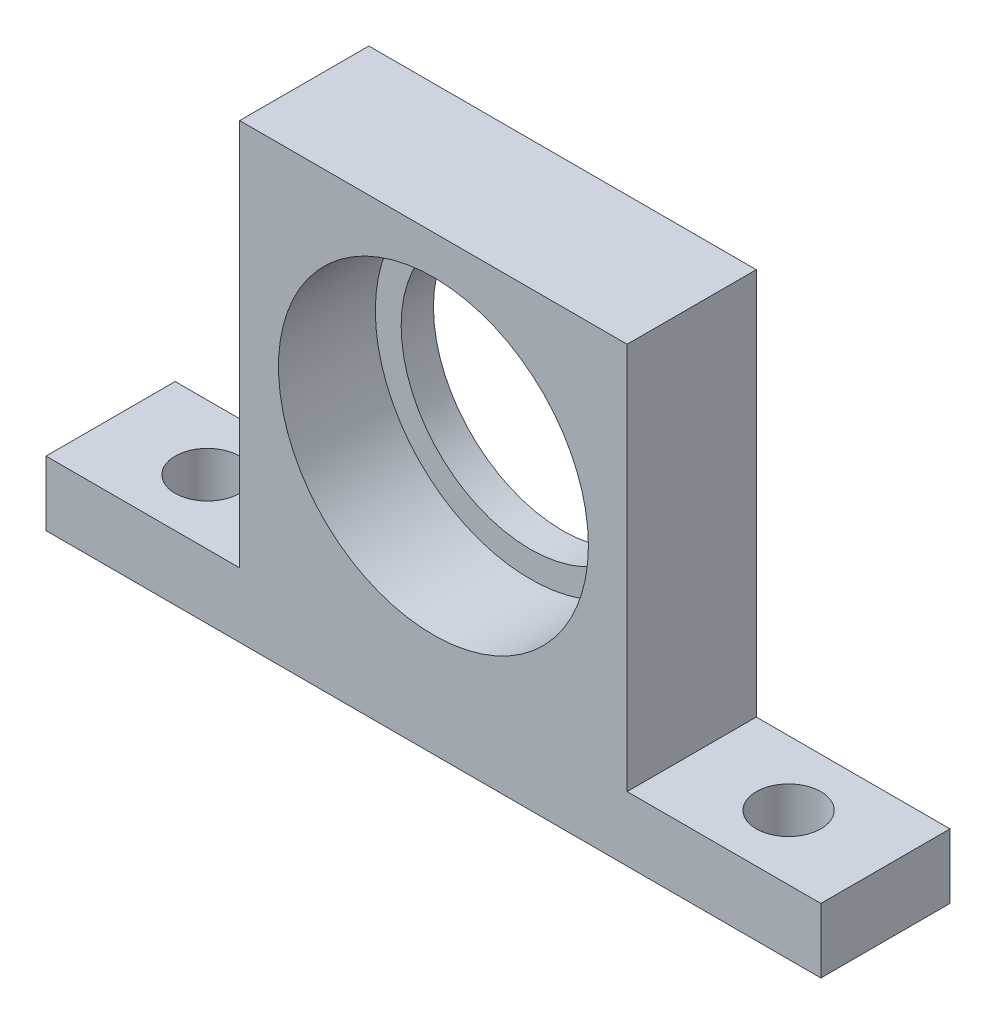
ISO-10303-21;
HEADER;
FILE_DESCRIPTION(('STEP AP214'),'2;1');
FILE_NAME('part.step','',(''),(''),'','','');
FILE_SCHEMA(('AUTOMOTIVE_DESIGN { 1 0 10303 214 1 1 1 1 }'));
ENDSEC;
DATA;
#1=APPLICATION_CONTEXT('core data for automotive mechanical design processes');
#2=APPLICATION_PROTOCOL_DEFINITION('international standard','automotive_design',2000,#1);
#3=PRODUCT_CONTEXT('',#1,'mechanical');
#4=PRODUCT('Part','Part','',(#3));
#5=PRODUCT_RELATED_PRODUCT_CATEGORY('part','',(#4));
#6=PRODUCT_DEFINITION_FORMATION('','',#4);
#7=PRODUCT_DEFINITION_CONTEXT('part definition',#1,'design');
#8=PRODUCT_DEFINITION('design','',#6,#7);
#9=PRODUCT_DEFINITION_SHAPE('','',#8);
#10=(LENGTH_UNIT() NAMED_UNIT(*) SI_UNIT(.MILLI.,.METRE.));
#11=(NAMED_UNIT(*) PLANE_ANGLE_UNIT() SI_UNIT($,.RADIAN.));
#12=(NAMED_UNIT(*) SI_UNIT($,.STERADIAN.) SOLID_ANGLE_UNIT());
#13=UNCERTAINTY_MEASURE_WITH_UNIT(LENGTH_MEASURE(1.E-05),#10,'distance_accuracy_value','');
#14=(GEOMETRIC_REPRESENTATION_CONTEXT(3) GLOBAL_UNCERTAINTY_ASSIGNED_CONTEXT((#13)) GLOBAL_UNIT_ASSIGNED_CONTEXT((#10,
#11,#12)) REPRESENTATION_CONTEXT('',''));
#15=CARTESIAN_POINT('',(0.,0.,0.));
#16=DIRECTION('',(0.,0.,1.));
#17=DIRECTION('',(1.,0.,0.));
#18=AXIS2_PLACEMENT_3D('',#15,#16,#17);
#19=CARTESIAN_POINT('',(-38.1,6.35,12.7));
#20=DIRECTION('',(0.,0.,-1.));
#21=DIRECTION('',(-1.,0.,0.));
#22=AXIS2_PLACEMENT_3D('',#19,#20,#21);
#23=PLANE('',#22);
#24=CARTESIAN_POINT('',(0.,25.4,12.7));
#25=DIRECTION('',(0.,0.,1.));
#26=DIRECTION('',(1.,0.,0.));
#27=AXIS2_PLACEMENT_3D('',#24,#25,#26);
#28=CIRCLE('',#27,15.24);
#29=CARTESIAN_POINT('',(15.24,25.4,12.7));
#30=VERTEX_POINT('',#29);
#31=EDGE_CURVE('E187',#30,#30,#28,.T.);
#32=ORIENTED_EDGE('',*,*,#31,.F.);
#33=EDGE_LOOP('',(#32));
#34=FACE_BOUND('',#33,.T.);
#35=DIRECTION('',(0.,-1.,0.));
#36=VECTOR('',#35,1.);
#37=CARTESIAN_POINT('',(-38.1,0.,12.7));
#38=LINE('',#37,#36);
#39=CARTESIAN_POINT('',(-38.1,6.35,12.7));
#40=VERTEX_POINT('',#39);
#41=CARTESIAN_POINT('',(-38.1,0.,12.7));
#42=VERTEX_POINT('',#41);
#43=EDGE_CURVE('E147',#40,#42,#38,.T.);
#44=ORIENTED_EDGE('',*,*,#43,.T.);
#45=DIRECTION('',(1.,0.,0.));
#46=VECTOR('',#45,1.);
#47=CARTESIAN_POINT('',(38.1,0.,12.7));
#48=LINE('',#47,#46);
#49=CARTESIAN_POINT('',(38.1,0.,12.7));
#50=VERTEX_POINT('',#49);
#51=EDGE_CURVE('E96',#42,#50,#48,.T.);
#52=ORIENTED_EDGE('',*,*,#51,.T.);
#53=DIRECTION('',(0.,1.,0.));
#54=VECTOR('',#53,1.);
#55=CARTESIAN_POINT('',(38.1,0.,12.7));
#56=LINE('',#55,#54);
#57=CARTESIAN_POINT('',(38.1,6.35,12.7));
#58=VERTEX_POINT('',#57);
#59=EDGE_CURVE('E163',#50,#58,#56,.T.);
#60=ORIENTED_EDGE('',*,*,#59,.T.);
#61=DIRECTION('',(-1.,0.,0.));
#62=VECTOR('',#61,1.);
#63=CARTESIAN_POINT('',(38.1,6.35,12.7));
#64=LINE('',#63,#62);
#65=CARTESIAN_POINT('',(19.05,6.35,12.7));
#66=VERTEX_POINT('',#65);
#67=EDGE_CURVE('E176',#58,#66,#64,.T.);
#68=ORIENTED_EDGE('',*,*,#67,.T.);
#69=DIRECTION('',(0.,1.,0.));
#70=VECTOR('',#69,1.);
#71=CARTESIAN_POINT('',(19.05,6.35,12.7));
#72=LINE('',#71,#70);
#73=CARTESIAN_POINT('',(19.05,44.45,12.7));
#74=VERTEX_POINT('',#73);
#75=EDGE_CURVE('E114',#66,#74,#72,.T.);
#76=ORIENTED_EDGE('',*,*,#75,.T.);
#77=DIRECTION('',(-1.,0.,0.));
#78=VECTOR('',#77,1.);
#79=CARTESIAN_POINT('',(-19.05,44.45,12.7));
#80=LINE('',#79,#78);
#81=CARTESIAN_POINT('',(-19.05,44.45,12.7));
#82=VERTEX_POINT('',#81);
#83=EDGE_CURVE('E109',#74,#82,#80,.T.);
#84=ORIENTED_EDGE('',*,*,#83,.T.);
#85=DIRECTION('',(0.,-1.,0.));
#86=VECTOR('',#85,1.);
#87=CARTESIAN_POINT('',(-19.05,6.35,12.7));
#88=LINE('',#87,#86);
#89=CARTESIAN_POINT('',(-19.05,6.35,12.7));
#90=VERTEX_POINT('',#89);
#91=EDGE_CURVE('E112',#82,#90,#88,.T.);
#92=ORIENTED_EDGE('',*,*,#91,.T.);
#93=DIRECTION('',(-1.,0.,0.));
#94=VECTOR('',#93,1.);
#95=CARTESIAN_POINT('',(-38.1,6.35,12.7));
#96=LINE('',#95,#94);
#97=EDGE_CURVE('E53',#90,#40,#96,.T.);
#98=ORIENTED_EDGE('',*,*,#97,.T.);
#99=EDGE_LOOP('',(#44,#52,#60,#68,#76,#84,#92,#98));
#100=FACE_BOUND('',#99,.T.);
#101=ADVANCED_FACE('F35',(#34,#100),#23,.F.);
#102=CARTESIAN_POINT('',(-38.1,6.35,0.));
#103=DIRECTION('',(0.,0.,-1.));
#104=DIRECTION('',(-1.,0.,0.));
#105=AXIS2_PLACEMENT_3D('',#102,#103,#104);
#106=PLANE('',#105);
#107=DIRECTION('',(0.,-1.,0.));
#108=VECTOR('',#107,1.);
#109=CARTESIAN_POINT('',(-38.1,0.,0.));
#110=LINE('',#109,#108);
#111=CARTESIAN_POINT('',(-38.1,6.35,0.));
#112=VERTEX_POINT('',#111);
#113=CARTESIAN_POINT('',(-38.1,0.,0.));
#114=VERTEX_POINT('',#113);
#115=EDGE_CURVE('E132',#112,#114,#110,.T.);
#116=ORIENTED_EDGE('',*,*,#115,.F.);
#117=DIRECTION('',(-1.,0.,0.));
#118=VECTOR('',#117,1.);
#119=CARTESIAN_POINT('',(-38.1,6.35,0.));
#120=LINE('',#119,#118);
#121=CARTESIAN_POINT('',(-19.05,6.35,0.));
#122=VERTEX_POINT('',#121);
#123=EDGE_CURVE('E88',#122,#112,#120,.T.);
#124=ORIENTED_EDGE('',*,*,#123,.F.);
#125=DIRECTION('',(0.,-1.,0.));
#126=VECTOR('',#125,1.);
#127=CARTESIAN_POINT('',(-19.05,6.35,0.));
#128=LINE('',#127,#126);
#129=CARTESIAN_POINT('',(-19.05,44.45,0.));
#130=VERTEX_POINT('',#129);
#131=EDGE_CURVE('E82',#130,#122,#128,.T.);
#132=ORIENTED_EDGE('',*,*,#131,.F.);
#133=DIRECTION('',(-1.,0.,0.));
#134=VECTOR('',#133,1.);
#135=CARTESIAN_POINT('',(-19.05,44.45,0.));
#136=LINE('',#135,#134);
#137=CARTESIAN_POINT('',(19.05,44.45,0.));
#138=VERTEX_POINT('',#137);
#139=EDGE_CURVE('E122',#138,#130,#136,.T.);
#140=ORIENTED_EDGE('',*,*,#139,.F.);
#141=DIRECTION('',(0.,1.,0.));
#142=VECTOR('',#141,1.);
#143=CARTESIAN_POINT('',(19.05,6.35,0.));
#144=LINE('',#143,#142);
#145=CARTESIAN_POINT('',(19.05,6.35,0.));
#146=VERTEX_POINT('',#145);
#147=EDGE_CURVE('E142',#146,#138,#144,.T.);
#148=ORIENTED_EDGE('',*,*,#147,.F.);
#149=DIRECTION('',(-1.,0.,0.));
#150=VECTOR('',#149,1.);
#151=CARTESIAN_POINT('',(38.1,6.35,0.));
#152=LINE('',#151,#150);
#153=CARTESIAN_POINT('',(38.1,6.35,0.));
#154=VERTEX_POINT('',#153);
#155=EDGE_CURVE('E140',#154,#146,#152,.T.);
#156=ORIENTED_EDGE('',*,*,#155,.F.);
#157=DIRECTION('',(0.,1.,0.));
#158=VECTOR('',#157,1.);
#159=CARTESIAN_POINT('',(38.1,0.,0.));
#160=LINE('',#159,#158);
#161=CARTESIAN_POINT('',(38.1,0.,0.));
#162=VERTEX_POINT('',#161);
#163=EDGE_CURVE('E138',#162,#154,#160,.T.);
#164=ORIENTED_EDGE('',*,*,#163,.F.);
#165=DIRECTION('',(1.,0.,0.));
#166=VECTOR('',#165,1.);
#167=CARTESIAN_POINT('',(38.1,0.,0.));
#168=LINE('',#167,#166);
#169=EDGE_CURVE('E135',#114,#162,#168,.T.);
#170=ORIENTED_EDGE('',*,*,#169,.F.);
#171=EDGE_LOOP('',(#116,#124,#132,#140,#148,#156,#164,#170));
#172=FACE_BOUND('',#171,.T.);
#173=CARTESIAN_POINT('',(0.,25.4,0.));
#174=DIRECTION('',(0.,0.,1.));
#175=DIRECTION('',(1.,0.,0.));
#176=AXIS2_PLACEMENT_3D('',#173,#174,#175);
#177=CIRCLE('',#176,12.7);
#178=CARTESIAN_POINT('',(12.7,25.4,0.));
#179=VERTEX_POINT('',#178);
#180=EDGE_CURVE('E136',#179,#179,#177,.T.);
#181=ORIENTED_EDGE('',*,*,#180,.T.);
#182=EDGE_LOOP('',(#181));
#183=FACE_BOUND('',#182,.T.);
#184=ADVANCED_FACE('F167',(#172,#183),#106,.T.);
#185=CARTESIAN_POINT('',(-38.1,0.,12.7));
#186=DIRECTION('',(1.,0.,0.));
#187=DIRECTION('',(0.,0.,-1.));
#188=AXIS2_PLACEMENT_3D('',#185,#186,#187);
#189=PLANE('',#188);
#190=ORIENTED_EDGE('',*,*,#115,.T.);
#191=DIRECTION('',(0.,0.,-1.));
#192=VECTOR('',#191,1.);
#193=CARTESIAN_POINT('',(-38.1,0.,12.7));
#194=LINE('',#193,#192);
#195=EDGE_CURVE('E12',#42,#114,#194,.T.);
#196=ORIENTED_EDGE('',*,*,#195,.F.);
#197=ORIENTED_EDGE('',*,*,#43,.F.);
#198=DIRECTION('',(0.,0.,-1.));
#199=VECTOR('',#198,1.);
#200=CARTESIAN_POINT('',(-38.1,6.35,12.7));
#201=LINE('',#200,#199);
#202=EDGE_CURVE('E128',#40,#112,#201,.T.);
#203=ORIENTED_EDGE('',*,*,#202,.T.);
#204=EDGE_LOOP('',(#190,#196,#197,#203));
#205=FACE_BOUND('',#204,.T.);
#206=ADVANCED_FACE('F37',(#205),#189,.F.);
#207=CARTESIAN_POINT('',(38.1,0.,12.7));
#208=DIRECTION('',(0.,1.,0.));
#209=DIRECTION('',(-1.,0.,0.));
#210=AXIS2_PLACEMENT_3D('',#207,#208,#209);
#211=PLANE('',#210);
#212=CARTESIAN_POINT('',(-28.575,0.,6.35));
#213=DIRECTION('',(0.,1.,0.));
#214=DIRECTION('',(0.,0.,1.));
#215=AXIS2_PLACEMENT_3D('',#212,#213,#214);
#216=CIRCLE('',#215,3.175);
#217=CARTESIAN_POINT('',(-28.575,0.,9.525));
#218=VERTEX_POINT('',#217);
#219=EDGE_CURVE('E196',#218,#218,#216,.T.);
#220=ORIENTED_EDGE('',*,*,#219,.T.);
#221=EDGE_LOOP('',(#220));
#222=FACE_BOUND('',#221,.T.);
#223=CARTESIAN_POINT('',(28.575,0.,6.35));
#224=DIRECTION('',(0.,1.,0.));
#225=DIRECTION('',(0.,0.,1.));
#226=AXIS2_PLACEMENT_3D('',#223,#224,#225);
#227=CIRCLE('',#226,3.175);
#228=CARTESIAN_POINT('',(28.575,0.,9.525));
#229=VERTEX_POINT('',#228);
#230=EDGE_CURVE('E190',#229,#229,#227,.T.);
#231=ORIENTED_EDGE('',*,*,#230,.T.);
#232=EDGE_LOOP('',(#231));
#233=FACE_BOUND('',#232,.T.);
#234=ORIENTED_EDGE('',*,*,#169,.T.);
#235=DIRECTION('',(0.,0.,-1.));
#236=VECTOR('',#235,1.);
#237=CARTESIAN_POINT('',(38.1,0.,12.7));
#238=LINE('',#237,#236);
#239=EDGE_CURVE('E45',#50,#162,#238,.T.);
#240=ORIENTED_EDGE('',*,*,#239,.F.);
#241=ORIENTED_EDGE('',*,*,#51,.F.);
#242=ORIENTED_EDGE('',*,*,#195,.T.);
#243=EDGE_LOOP('',(#234,#240,#241,#242));
#244=FACE_BOUND('',#243,.T.);
#245=ADVANCED_FACE('F243',(#222,#233,#244),#211,.F.);
#246=CARTESIAN_POINT('',(38.1,0.,12.7));
#247=DIRECTION('',(-1.,0.,0.));
#248=DIRECTION('',(0.,0.,1.));
#249=AXIS2_PLACEMENT_3D('',#246,#247,#248);
#250=PLANE('',#249);
#251=ORIENTED_EDGE('',*,*,#163,.T.);
#252=DIRECTION('',(0.,0.,-1.));
#253=VECTOR('',#252,1.);
#254=CARTESIAN_POINT('',(38.1,6.35,12.7));
#255=LINE('',#254,#253);
#256=EDGE_CURVE('E154',#58,#154,#255,.T.);
#257=ORIENTED_EDGE('',*,*,#256,.F.);
#258=ORIENTED_EDGE('',*,*,#59,.F.);
#259=ORIENTED_EDGE('',*,*,#239,.T.);
#260=EDGE_LOOP('',(#251,#257,#258,#259));
#261=FACE_BOUND('',#260,.T.);
#262=ADVANCED_FACE('F161',(#261),#250,.F.);
#263=CARTESIAN_POINT('',(38.1,6.35,12.7));
#264=DIRECTION('',(0.,-1.,0.));
#265=DIRECTION('',(1.,0.,0.));
#266=AXIS2_PLACEMENT_3D('',#263,#264,#265);
#267=PLANE('',#266);
#268=CARTESIAN_POINT('',(28.575,6.35,6.35));
#269=DIRECTION('',(0.,1.,0.));
#270=DIRECTION('',(0.,0.,1.));
#271=AXIS2_PLACEMENT_3D('',#268,#269,#270);
#272=CIRCLE('',#271,3.17499999999998);
#273=CARTESIAN_POINT('',(28.575,6.35,9.52499999999998));
#274=VERTEX_POINT('',#273);
#275=EDGE_CURVE('E193',#274,#274,#272,.T.);
#276=ORIENTED_EDGE('',*,*,#275,.F.);
#277=EDGE_LOOP('',(#276));
#278=FACE_BOUND('',#277,.T.);
#279=ORIENTED_EDGE('',*,*,#155,.T.);
#280=DIRECTION('',(0.,0.,-1.));
#281=VECTOR('',#280,1.);
#282=CARTESIAN_POINT('',(19.05,6.35,12.7));
#283=LINE('',#282,#281);
#284=EDGE_CURVE('E151',#66,#146,#283,.T.);
#285=ORIENTED_EDGE('',*,*,#284,.F.);
#286=ORIENTED_EDGE('',*,*,#67,.F.);
#287=ORIENTED_EDGE('',*,*,#256,.T.);
#288=EDGE_LOOP('',(#279,#285,#286,#287));
#289=FACE_BOUND('',#288,.T.);
#290=ADVANCED_FACE('F172',(#278,#289),#267,.F.);
#291=CARTESIAN_POINT('',(19.05,6.35,12.7));
#292=DIRECTION('',(-1.,0.,0.));
#293=DIRECTION('',(0.,-1.,0.));
#294=AXIS2_PLACEMENT_3D('',#291,#292,#293);
#295=PLANE('',#294);
#296=ORIENTED_EDGE('',*,*,#147,.T.);
#297=DIRECTION('',(0.,0.,-1.));
#298=VECTOR('',#297,1.);
#299=CARTESIAN_POINT('',(19.05,44.45,12.7));
#300=LINE('',#299,#298);
#301=EDGE_CURVE('E123',#74,#138,#300,.T.);
#302=ORIENTED_EDGE('',*,*,#301,.F.);
#303=ORIENTED_EDGE('',*,*,#75,.F.);
#304=ORIENTED_EDGE('',*,*,#284,.T.);
#305=EDGE_LOOP('',(#296,#302,#303,#304));
#306=FACE_BOUND('',#305,.T.);
#307=ADVANCED_FACE('F175',(#306),#295,.F.);
#308=CARTESIAN_POINT('',(-19.05,44.45,12.7));
#309=DIRECTION('',(0.,-1.,0.));
#310=DIRECTION('',(0.,0.,-1.));
#311=AXIS2_PLACEMENT_3D('',#308,#309,#310);
#312=PLANE('',#311);
#313=ORIENTED_EDGE('',*,*,#139,.T.);
#314=DIRECTION('',(0.,0.,-1.));
#315=VECTOR('',#314,1.);
#316=CARTESIAN_POINT('',(-19.05,44.45,12.7));
#317=LINE('',#316,#315);
#318=EDGE_CURVE('E119',#82,#130,#317,.T.);
#319=ORIENTED_EDGE('',*,*,#318,.F.);
#320=ORIENTED_EDGE('',*,*,#83,.F.);
#321=ORIENTED_EDGE('',*,*,#301,.T.);
#322=EDGE_LOOP('',(#313,#319,#320,#321));
#323=FACE_BOUND('',#322,.T.);
#324=ADVANCED_FACE('F120',(#323),#312,.F.);
#325=CARTESIAN_POINT('',(-19.05,6.35,12.7));
#326=DIRECTION('',(1.,0.,0.));
#327=DIRECTION('',(0.,1.,0.));
#328=AXIS2_PLACEMENT_3D('',#325,#326,#327);
#329=PLANE('',#328);
#330=ORIENTED_EDGE('',*,*,#131,.T.);
#331=DIRECTION('',(0.,0.,-1.));
#332=VECTOR('',#331,1.);
#333=CARTESIAN_POINT('',(-19.05,6.35,12.7));
#334=LINE('',#333,#332);
#335=EDGE_CURVE('E124',#90,#122,#334,.T.);
#336=ORIENTED_EDGE('',*,*,#335,.F.);
#337=ORIENTED_EDGE('',*,*,#91,.F.);
#338=ORIENTED_EDGE('',*,*,#318,.T.);
#339=EDGE_LOOP('',(#330,#336,#337,#338));
#340=FACE_BOUND('',#339,.T.);
#341=ADVANCED_FACE('F126',(#340),#329,.F.);
#342=CARTESIAN_POINT('',(-38.1,6.35,12.7));
#343=DIRECTION('',(0.,-1.,0.));
#344=DIRECTION('',(1.,0.,0.));
#345=AXIS2_PLACEMENT_3D('',#342,#343,#344);
#346=PLANE('',#345);
#347=CARTESIAN_POINT('',(-28.575,6.35,6.35));
#348=DIRECTION('',(0.,1.,0.));
#349=DIRECTION('',(0.,0.,1.));
#350=AXIS2_PLACEMENT_3D('',#347,#348,#349);
#351=CIRCLE('',#350,3.17499999999999);
#352=CARTESIAN_POINT('',(-28.575,6.35,9.52499999999999));
#353=VERTEX_POINT('',#352);
#354=EDGE_CURVE('E199',#353,#353,#351,.T.);
#355=ORIENTED_EDGE('',*,*,#354,.F.);
#356=EDGE_LOOP('',(#355));
#357=FACE_BOUND('',#356,.T.);
#358=ORIENTED_EDGE('',*,*,#123,.T.);
#359=ORIENTED_EDGE('',*,*,#202,.F.);
#360=ORIENTED_EDGE('',*,*,#97,.F.);
#361=ORIENTED_EDGE('',*,*,#335,.T.);
#362=EDGE_LOOP('',(#358,#359,#360,#361));
#363=FACE_BOUND('',#362,.T.);
#364=ADVANCED_FACE('F205',(#357,#363),#346,.F.);
#365=CARTESIAN_POINT('',(0.,25.4,12.7));
#366=DIRECTION('',(0.,0.,-1.));
#367=DIRECTION('',(-1.,0.,0.));
#368=AXIS2_PLACEMENT_3D('',#365,#366,#367);
#369=CYLINDRICAL_SURFACE('',#368,12.7);
#370=CARTESIAN_POINT('',(0.,25.4,3.175));
#371=DIRECTION('',(0.,0.,-1.));
#372=DIRECTION('',(-1.,0.,0.));
#373=AXIS2_PLACEMENT_3D('',#370,#371,#372);
#374=CIRCLE('',#373,12.7);
#375=CARTESIAN_POINT('',(-12.7,25.4,3.175));
#376=VERTEX_POINT('',#375);
#377=EDGE_CURVE('E39',#376,#376,#374,.T.);
#378=ORIENTED_EDGE('',*,*,#377,.F.);
#379=EDGE_LOOP('',(#378));
#380=FACE_BOUND('',#379,.T.);
#381=ORIENTED_EDGE('',*,*,#180,.F.);
#382=EDGE_LOOP('',(#381));
#383=FACE_BOUND('',#382,.T.);
#384=ADVANCED_FACE('F207',(#380,#383),#369,.F.);
#385=CARTESIAN_POINT('',(-38.1,6.35,3.175));
#386=DIRECTION('',(0.,0.,-1.));
#387=DIRECTION('',(-1.,0.,0.));
#388=AXIS2_PLACEMENT_3D('',#385,#386,#387);
#389=PLANE('',#388);
#390=ORIENTED_EDGE('',*,*,#377,.T.);
#391=EDGE_LOOP('',(#390));
#392=FACE_BOUND('',#391,.T.);
#393=CARTESIAN_POINT('',(0.,25.4,3.175));
#394=DIRECTION('',(0.,0.,-1.));
#395=DIRECTION('',(-1.,0.,0.));
#396=AXIS2_PLACEMENT_3D('',#393,#394,#395);
#397=CIRCLE('',#396,15.24);
#398=CARTESIAN_POINT('',(-15.24,25.4,3.175));
#399=VERTEX_POINT('',#398);
#400=EDGE_CURVE('E184',#399,#399,#397,.F.);
#401=ORIENTED_EDGE('',*,*,#400,.T.);
#402=EDGE_LOOP('',(#401));
#403=FACE_BOUND('',#402,.T.);
#404=ADVANCED_FACE('F213',(#392,#403),#389,.F.);
#405=CARTESIAN_POINT('',(0.,25.4,-43.1052293811319));
#406=DIRECTION('',(0.,0.,1.));
#407=DIRECTION('',(1.,0.,0.));
#408=AXIS2_PLACEMENT_3D('',#405,#406,#407);
#409=CYLINDRICAL_SURFACE('',#408,15.24);
#410=ORIENTED_EDGE('',*,*,#31,.T.);
#411=EDGE_LOOP('',(#410));
#412=FACE_BOUND('',#411,.T.);
#413=ORIENTED_EDGE('',*,*,#400,.F.);
#414=EDGE_LOOP('',(#413));
#415=FACE_BOUND('',#414,.T.);
#416=ADVANCED_FACE('F228',(#412,#415),#409,.F.);
#417=CARTESIAN_POINT('',(28.575,6.35,6.35));
#418=DIRECTION('',(0.,1.,0.));
#419=DIRECTION('',(0.,0.,1.));
#420=AXIS2_PLACEMENT_3D('',#417,#418,#419);
#421=CYLINDRICAL_SURFACE('',#420,3.17499999999999);
#422=ORIENTED_EDGE('',*,*,#230,.F.);
#423=EDGE_LOOP('',(#422));
#424=FACE_BOUND('',#423,.T.);
#425=ORIENTED_EDGE('',*,*,#275,.T.);
#426=EDGE_LOOP('',(#425));
#427=FACE_BOUND('',#426,.T.);
#428=ADVANCED_FACE('F232',(#424,#427),#421,.F.);
#429=CARTESIAN_POINT('',(-28.575,6.35,6.35));
#430=DIRECTION('',(0.,1.,0.));
#431=DIRECTION('',(0.,0.,1.));
#432=AXIS2_PLACEMENT_3D('',#429,#430,#431);
#433=CYLINDRICAL_SURFACE('',#432,3.17499999999999);
#434=ORIENTED_EDGE('',*,*,#219,.F.);
#435=EDGE_LOOP('',(#434));
#436=FACE_BOUND('',#435,.T.);
#437=ORIENTED_EDGE('',*,*,#354,.T.);
#438=EDGE_LOOP('',(#437));
#439=FACE_BOUND('',#438,.T.);
#440=ADVANCED_FACE('F203',(#436,#439),#433,.F.);
#441=CLOSED_SHELL('',(#101,#184,#206,#245,#262,#290,#307,#324,#341,#364,#384,#404,#416,#428,#440));
#442=MANIFOLD_SOLID_BREP('B2',#441);
#443=ADVANCED_BREP_SHAPE_REPRESENTATION('',(#18,#442),#14);
#444=SHAPE_DEFINITION_REPRESENTATION(#9,#443);
ENDSEC;
END-ISO-10303-21;
